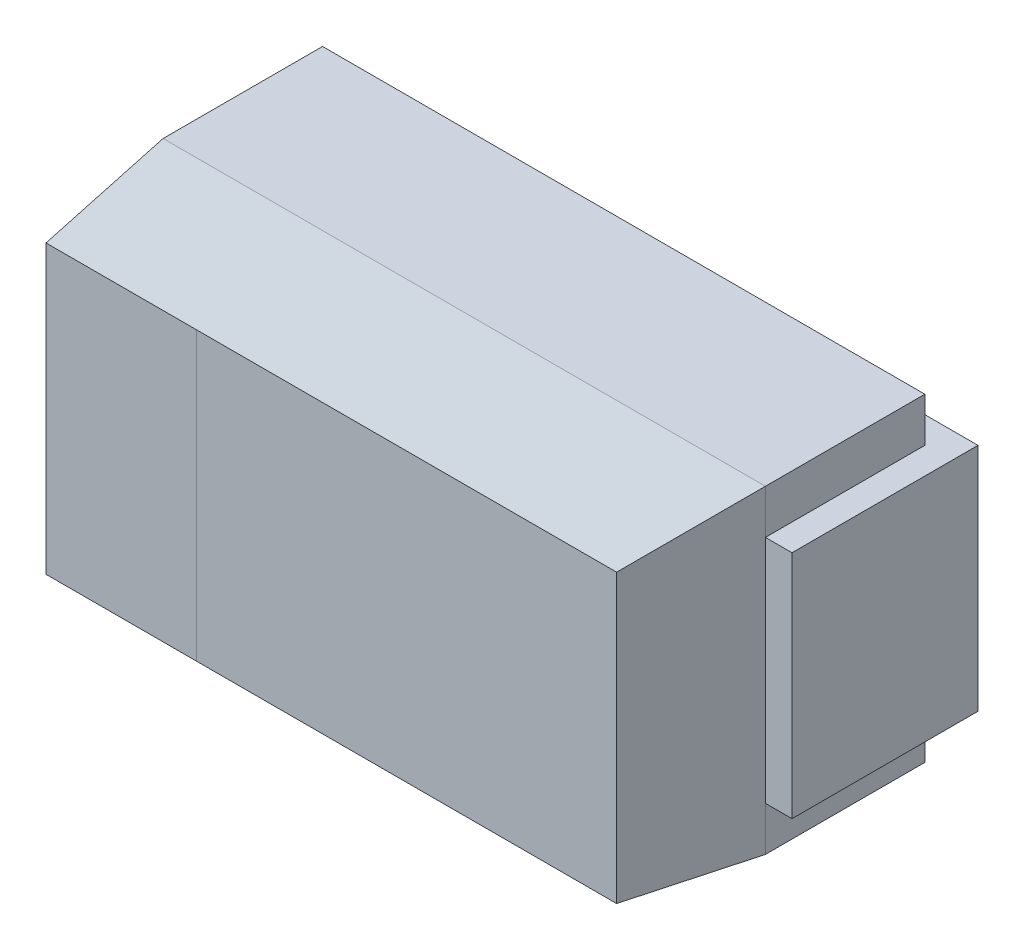
ISO-10303-21;
HEADER;
FILE_DESCRIPTION(('STEP AP214'),'2;1');
FILE_NAME('part.step','',(''),(''),'','','');
FILE_SCHEMA(('AUTOMOTIVE_DESIGN { 1 0 10303 214 1 1 1 1 }'));
ENDSEC;
DATA;
#1=APPLICATION_CONTEXT('core data for automotive mechanical design processes');
#2=APPLICATION_PROTOCOL_DEFINITION('international standard','automotive_design',2000,#1);
#3=PRODUCT_CONTEXT('',#1,'mechanical');
#4=PRODUCT('Part','Part','',(#3));
#5=PRODUCT_RELATED_PRODUCT_CATEGORY('part','',(#4));
#6=PRODUCT_DEFINITION_FORMATION('','',#4);
#7=PRODUCT_DEFINITION_CONTEXT('part definition',#1,'design');
#8=PRODUCT_DEFINITION('design','',#6,#7);
#9=PRODUCT_DEFINITION_SHAPE('','',#8);
#10=(LENGTH_UNIT() NAMED_UNIT(*) SI_UNIT(.MILLI.,.METRE.));
#11=(NAMED_UNIT(*) PLANE_ANGLE_UNIT() SI_UNIT($,.RADIAN.));
#12=(NAMED_UNIT(*) SI_UNIT($,.STERADIAN.) SOLID_ANGLE_UNIT());
#13=UNCERTAINTY_MEASURE_WITH_UNIT(LENGTH_MEASURE(1.E-05),#10,'distance_accuracy_value','');
#14=(GEOMETRIC_REPRESENTATION_CONTEXT(3) GLOBAL_UNCERTAINTY_ASSIGNED_CONTEXT((#13)) GLOBAL_UNIT_ASSIGNED_CONTEXT((#10,
#11,#12)) REPRESENTATION_CONTEXT('',''));
#15=CARTESIAN_POINT('',(0.,0.,0.));
#16=DIRECTION('',(0.,0.,1.));
#17=DIRECTION('',(1.,0.,0.));
#18=AXIS2_PLACEMENT_3D('',#15,#16,#17);
#19=CARTESIAN_POINT('',(-1.60988085477938,0.901,1.80099287683849));
#20=DIRECTION('',(-0.992876838486922,0.,0.119145220618434));
#21=DIRECTION('',(-0.119145220618434,0.,-0.992876838486922));
#22=AXIS2_PLACEMENT_3D('',#19,#20,#21);
#23=PLANE('',#22);
#24=CARTESIAN_POINT('',(-1.60976340694006,0.81,1.802));
#25=DIRECTION('',(0.,-1.,0.));
#26=VECTOR('',#25,1.);
#27=LINE('',#24,#26);
#28=CARTESIAN_POINT('',(-1.60996056782334,0.81,1.8009952681388));
#29=VERTEX_POINT('',#28);
#30=CARTESIAN_POINT('',(-1.60992113564669,-0.81,1.8009952681388));
#31=VERTEX_POINT('',#30);
#32=EDGE_CURVE('E416',#29,#31,#27,.T.);
#33=ORIENTED_EDGE('',*,*,#32,.F.);
#34=CARTESIAN_POINT('',(-1.61,0.81,1.8));
#35=DIRECTION('',(-0.118308451008768,0.118308451008765,-0.985903758406373));
#36=VECTOR('',#35,1.);
#37=LINE('',#34,#36);
#38=CARTESIAN_POINT('',(-1.7,0.9,1.05));
#39=VERTEX_POINT('',#38);
#40=EDGE_CURVE('E198',#29,#39,#37,.T.);
#41=ORIENTED_EDGE('',*,*,#40,.T.);
#42=DIRECTION('',(0.,-1.,0.));
#43=VECTOR('',#42,1.);
#44=CARTESIAN_POINT('',(-1.7,0.,1.05));
#45=LINE('',#44,#43);
#46=CARTESIAN_POINT('',(-1.7,0.65,1.05));
#47=VERTEX_POINT('',#46);
#48=EDGE_CURVE('E387',#39,#47,#45,.T.);
#49=ORIENTED_EDGE('',*,*,#48,.T.);
#50=DIRECTION('',(0.,1.,0.));
#51=VECTOR('',#50,1.);
#52=CARTESIAN_POINT('',(-1.7,0.,1.05));
#53=LINE('',#52,#51);
#54=CARTESIAN_POINT('',(-1.7,-0.65,1.05));
#55=VERTEX_POINT('',#54);
#56=EDGE_CURVE('E404',#55,#47,#53,.T.);
#57=ORIENTED_EDGE('',*,*,#56,.F.);
#58=DIRECTION('',(0.,-1.,0.));
#59=VECTOR('',#58,1.);
#60=CARTESIAN_POINT('',(-1.7,0.,1.05));
#61=LINE('',#60,#59);
#62=CARTESIAN_POINT('',(-1.7,-0.9,1.05));
#63=VERTEX_POINT('',#62);
#64=EDGE_CURVE('E389',#55,#63,#61,.T.);
#65=ORIENTED_EDGE('',*,*,#64,.T.);
#66=CARTESIAN_POINT('',(-1.7,-0.9,1.05));
#67=DIRECTION('',(0.118308451008768,0.118308451008765,0.985903758406373));
#68=VECTOR('',#67,1.);
#69=LINE('',#66,#68);
#70=EDGE_CURVE('E165',#63,#31,#69,.T.);
#71=ORIENTED_EDGE('',*,*,#70,.T.);
#72=EDGE_LOOP('',(#33,#41,#49,#57,#65,#71));
#73=FACE_BOUND('',#72,.T.);
#74=ADVANCED_FACE('F16',(#73),#23,.T.);
#75=CARTESIAN_POINT('',(-1.851,0.651,1.05));
#76=DIRECTION('',(0.,0.,1.));
#77=DIRECTION('',(0.,-1.,0.));
#78=AXIS2_PLACEMENT_3D('',#75,#76,#77);
#79=PLANE('',#78);
#80=ORIENTED_EDGE('',*,*,#56,.T.);
#81=DIRECTION('',(-1.,0.,0.));
#82=VECTOR('',#81,1.);
#83=CARTESIAN_POINT('',(-1.775,0.65,1.05));
#84=LINE('',#83,#82);
#85=CARTESIAN_POINT('',(-1.85,0.65,1.05));
#86=VERTEX_POINT('',#85);
#87=EDGE_CURVE('E407',#47,#86,#84,.T.);
#88=ORIENTED_EDGE('',*,*,#87,.T.);
#89=DIRECTION('',(0.,1.,0.));
#90=VECTOR('',#89,1.);
#91=CARTESIAN_POINT('',(-1.85,0.,1.05));
#92=LINE('',#91,#90);
#93=CARTESIAN_POINT('',(-1.85,-0.65,1.05));
#94=VERTEX_POINT('',#93);
#95=EDGE_CURVE('E360',#94,#86,#92,.T.);
#96=ORIENTED_EDGE('',*,*,#95,.F.);
#97=DIRECTION('',(1.,0.,0.));
#98=VECTOR('',#97,1.);
#99=CARTESIAN_POINT('',(-1.775,-0.65,1.05));
#100=LINE('',#99,#98);
#101=EDGE_CURVE('E408',#94,#55,#100,.T.);
#102=ORIENTED_EDGE('',*,*,#101,.T.);
#103=EDGE_LOOP('',(#80,#88,#96,#102));
#104=FACE_BOUND('',#103,.T.);
#105=ADVANCED_FACE('F440',(#104),#79,.T.);
#106=CARTESIAN_POINT('',(-1.611,0.811,1.802));
#107=DIRECTION('',(0.,0.,1.));
#108=DIRECTION('',(0.,-1.,0.));
#109=AXIS2_PLACEMENT_3D('',#106,#107,#108);
#110=PLANE('',#109);
#111=DIRECTION('',(1.,0.,0.));
#112=VECTOR('',#111,1.);
#113=CARTESIAN_POINT('',(-1.701,0.80976,1.802));
#114=LINE('',#113,#112);
#115=CARTESIAN_POINT('',(-0.76,0.81,1.8008));
#116=VERTEX_POINT('',#115);
#117=EDGE_CURVE('E363',#29,#116,#114,.T.);
#118=ORIENTED_EDGE('',*,*,#117,.F.);
#119=ORIENTED_EDGE('',*,*,#32,.T.);
#120=DIRECTION('',(-1.,0.,0.));
#121=VECTOR('',#120,1.);
#122=CARTESIAN_POINT('',(-1.701,-0.809760000000001,1.802));
#123=LINE('',#122,#121);
#124=CARTESIAN_POINT('',(-0.76,-0.81,1.8008));
#125=VERTEX_POINT('',#124);
#126=EDGE_CURVE('E158',#125,#31,#123,.T.);
#127=ORIENTED_EDGE('',*,*,#126,.F.);
#128=CARTESIAN_POINT('',(-0.76,0.81,1.8));
#129=DIRECTION('',(0.,-1.,0.));
#130=VECTOR('',#129,1.);
#131=LINE('',#128,#130);
#132=EDGE_CURVE('E376',#116,#125,#131,.T.);
#133=ORIENTED_EDGE('',*,*,#132,.F.);
#134=EDGE_LOOP('',(#118,#119,#127,#133));
#135=FACE_BOUND('',#134,.T.);
#136=ADVANCED_FACE('F468',(#135),#110,.T.);
#137=CARTESIAN_POINT('',(-0.761,0.811,1.8));
#138=DIRECTION('',(0.,0.,1.));
#139=DIRECTION('',(0.,-1.,0.));
#140=AXIS2_PLACEMENT_3D('',#137,#138,#139);
#141=PLANE('',#140);
#142=DIRECTION('',(0.,1.,0.));
#143=VECTOR('',#142,1.);
#144=CARTESIAN_POINT('',(1.61,0.,1.8));
#145=LINE('',#144,#143);
#146=CARTESIAN_POINT('',(1.61,-0.81,1.8));
#147=VERTEX_POINT('',#146);
#148=CARTESIAN_POINT('',(1.61,0.810000000000001,1.8));
#149=VERTEX_POINT('',#148);
#150=EDGE_CURVE('E153',#147,#149,#145,.T.);
#151=ORIENTED_EDGE('',*,*,#150,.T.);
#152=DIRECTION('',(1.,0.,0.));
#153=VECTOR('',#152,1.);
#154=CARTESIAN_POINT('',(0.,0.81,1.8));
#155=LINE('',#154,#153);
#156=EDGE_CURVE('E366',#116,#149,#155,.T.);
#157=ORIENTED_EDGE('',*,*,#156,.F.);
#158=ORIENTED_EDGE('',*,*,#132,.T.);
#159=DIRECTION('',(-1.,0.,0.));
#160=VECTOR('',#159,1.);
#161=CARTESIAN_POINT('',(0.,-0.81,1.8));
#162=LINE('',#161,#160);
#163=EDGE_CURVE('E371',#147,#125,#162,.T.);
#164=ORIENTED_EDGE('',*,*,#163,.F.);
#165=EDGE_LOOP('',(#151,#157,#158,#164));
#166=FACE_BOUND('',#165,.T.);
#167=ADVANCED_FACE('F477',(#166),#141,.T.);
#168=CARTESIAN_POINT('',(-1.701,-0.809880854779382,1.80099287683849));
#169=DIRECTION('',(0.,-0.992876838486922,0.11914522061843));
#170=DIRECTION('',(0.,-0.11914522061843,-0.992876838486922));
#171=AXIS2_PLACEMENT_3D('',#168,#169,#170);
#172=PLANE('',#171);
#173=DIRECTION('',(-1.,0.,0.));
#174=VECTOR('',#173,1.);
#175=CARTESIAN_POINT('',(0.,-0.9,1.05));
#176=LINE('',#175,#174);
#177=CARTESIAN_POINT('',(1.7,-0.9,1.05));
#178=VERTEX_POINT('',#177);
#179=EDGE_CURVE('E161',#178,#63,#176,.T.);
#180=ORIENTED_EDGE('',*,*,#179,.F.);
#181=DIRECTION('',(-0.118308451008765,0.118308451008764,0.985903758406374));
#182=VECTOR('',#181,1.);
#183=CARTESIAN_POINT('',(1.7,-0.899999999999999,1.05));
#184=LINE('',#183,#182);
#185=EDGE_CURVE('E145',#178,#147,#184,.T.);
#186=ORIENTED_EDGE('',*,*,#185,.T.);
#187=ORIENTED_EDGE('',*,*,#163,.T.);
#188=ORIENTED_EDGE('',*,*,#126,.T.);
#189=ORIENTED_EDGE('',*,*,#70,.F.);
#190=EDGE_LOOP('',(#180,#186,#187,#188,#189));
#191=FACE_BOUND('',#190,.T.);
#192=ADVANCED_FACE('F163',(#191),#172,.T.);
#193=CARTESIAN_POINT('',(-1.851,-0.651,0.));
#194=DIRECTION('',(0.,0.,-1.));
#195=DIRECTION('',(0.,1.,0.));
#196=AXIS2_PLACEMENT_3D('',#193,#194,#195);
#197=PLANE('',#196);
#198=DIRECTION('',(0.,1.,0.));
#199=VECTOR('',#198,1.);
#200=CARTESIAN_POINT('',(-0.75,0.,0.));
#201=LINE('',#200,#199);
#202=CARTESIAN_POINT('',(-0.75,-0.65,0.));
#203=VERTEX_POINT('',#202);
#204=CARTESIAN_POINT('',(-0.75,0.65,0.));
#205=VERTEX_POINT('',#204);
#206=EDGE_CURVE('E347',#203,#205,#201,.T.);
#207=ORIENTED_EDGE('',*,*,#206,.F.);
#208=DIRECTION('',(1.,0.,0.));
#209=VECTOR('',#208,1.);
#210=CARTESIAN_POINT('',(-1.3,-0.65,0.));
#211=LINE('',#210,#209);
#212=CARTESIAN_POINT('',(-1.85,-0.65,0.));
#213=VERTEX_POINT('',#212);
#214=EDGE_CURVE('E354',#213,#203,#211,.T.);
#215=ORIENTED_EDGE('',*,*,#214,.F.);
#216=DIRECTION('',(0.,-1.,0.));
#217=VECTOR('',#216,1.);
#218=CARTESIAN_POINT('',(-1.85,0.,0.));
#219=LINE('',#218,#217);
#220=CARTESIAN_POINT('',(-1.85,0.65,0.));
#221=VERTEX_POINT('',#220);
#222=EDGE_CURVE('E157',#221,#213,#219,.T.);
#223=ORIENTED_EDGE('',*,*,#222,.F.);
#224=DIRECTION('',(-1.,0.,0.));
#225=VECTOR('',#224,1.);
#226=CARTESIAN_POINT('',(-1.3,0.65,0.));
#227=LINE('',#226,#225);
#228=EDGE_CURVE('E341',#205,#221,#227,.T.);
#229=ORIENTED_EDGE('',*,*,#228,.F.);
#230=EDGE_LOOP('',(#207,#215,#223,#229));
#231=FACE_BOUND('',#230,.T.);
#232=ADVANCED_FACE('F508',(#231),#197,.T.);
#233=CARTESIAN_POINT('',(-1.85,0.651,-0.001));
#234=DIRECTION('',(-1.,0.,0.));
#235=DIRECTION('',(0.,-1.,0.));
#236=AXIS2_PLACEMENT_3D('',#233,#234,#235);
#237=PLANE('',#236);
#238=ORIENTED_EDGE('',*,*,#95,.T.);
#239=DIRECTION('',(0.,0.,1.));
#240=VECTOR('',#239,1.);
#241=CARTESIAN_POINT('',(-1.85,0.65,0.525));
#242=LINE('',#241,#240);
#243=EDGE_CURVE('E338',#221,#86,#242,.T.);
#244=ORIENTED_EDGE('',*,*,#243,.F.);
#245=ORIENTED_EDGE('',*,*,#222,.T.);
#246=DIRECTION('',(0.,0.,-1.));
#247=VECTOR('',#246,1.);
#248=CARTESIAN_POINT('',(-1.85,-0.65,0.525));
#249=LINE('',#248,#247);
#250=EDGE_CURVE('E350',#94,#213,#249,.T.);
#251=ORIENTED_EDGE('',*,*,#250,.F.);
#252=EDGE_LOOP('',(#238,#244,#245,#251));
#253=FACE_BOUND('',#252,.T.);
#254=ADVANCED_FACE('F216',(#253),#237,.T.);
#255=CARTESIAN_POINT('',(-1.701,0.900119145220619,1.04900712316151));
#256=DIRECTION('',(0.,0.992876838486922,0.119145220618431));
#257=DIRECTION('',(0.,-0.119145220618431,0.992876838486922));
#258=AXIS2_PLACEMENT_3D('',#255,#256,#257);
#259=PLANE('',#258);
#260=DIRECTION('',(1.,0.,0.));
#261=VECTOR('',#260,1.);
#262=CARTESIAN_POINT('',(0.,0.9,1.05));
#263=LINE('',#262,#261);
#264=CARTESIAN_POINT('',(1.7,0.9,1.05000000000001));
#265=VERTEX_POINT('',#264);
#266=EDGE_CURVE('E380',#39,#265,#263,.T.);
#267=ORIENTED_EDGE('',*,*,#266,.F.);
#268=ORIENTED_EDGE('',*,*,#40,.F.);
#269=ORIENTED_EDGE('',*,*,#117,.T.);
#270=ORIENTED_EDGE('',*,*,#156,.T.);
#271=DIRECTION('',(0.118308451008765,0.118308451008765,-0.985903758406374));
#272=VECTOR('',#271,1.);
#273=CARTESIAN_POINT('',(1.61,0.81,1.8));
#274=LINE('',#273,#272);
#275=EDGE_CURVE('E359',#149,#265,#274,.T.);
#276=ORIENTED_EDGE('',*,*,#275,.T.);
#277=EDGE_LOOP('',(#267,#268,#269,#270,#276));
#278=FACE_BOUND('',#277,.T.);
#279=ADVANCED_FACE('F205',(#278),#259,.T.);
#280=CARTESIAN_POINT('',(0.75,0.651,-0.001));
#281=DIRECTION('',(-1.,0.,0.));
#282=DIRECTION('',(0.,-1.,0.));
#283=AXIS2_PLACEMENT_3D('',#280,#281,#282);
#284=PLANE('',#283);
#285=DIRECTION('',(0.,-1.,0.));
#286=VECTOR('',#285,1.);
#287=CARTESIAN_POINT('',(0.75,0.,0.15));
#288=LINE('',#287,#286);
#289=CARTESIAN_POINT('',(0.75,0.65,0.15));
#290=VERTEX_POINT('',#289);
#291=CARTESIAN_POINT('',(0.75,-0.65,0.15));
#292=VERTEX_POINT('',#291);
#293=EDGE_CURVE('E179',#290,#292,#288,.T.);
#294=ORIENTED_EDGE('',*,*,#293,.F.);
#295=DIRECTION('',(0.,0.,-1.));
#296=VECTOR('',#295,1.);
#297=CARTESIAN_POINT('',(0.75,0.65,0.075));
#298=LINE('',#297,#296);
#299=CARTESIAN_POINT('',(0.75,0.65,0.));
#300=VERTEX_POINT('',#299);
#301=EDGE_CURVE('E171',#290,#300,#298,.T.);
#302=ORIENTED_EDGE('',*,*,#301,.T.);
#303=DIRECTION('',(0.,1.,0.));
#304=VECTOR('',#303,1.);
#305=CARTESIAN_POINT('',(0.75,0.,0.));
#306=LINE('',#305,#304);
#307=CARTESIAN_POINT('',(0.75,-0.65,0.));
#308=VERTEX_POINT('',#307);
#309=EDGE_CURVE('E180',#308,#300,#306,.T.);
#310=ORIENTED_EDGE('',*,*,#309,.F.);
#311=DIRECTION('',(0.,0.,1.));
#312=VECTOR('',#311,1.);
#313=CARTESIAN_POINT('',(0.75,-0.65,0.075));
#314=LINE('',#313,#312);
#315=EDGE_CURVE('E282',#308,#292,#314,.T.);
#316=ORIENTED_EDGE('',*,*,#315,.T.);
#317=EDGE_LOOP('',(#294,#302,#310,#316));
#318=FACE_BOUND('',#317,.T.);
#319=ADVANCED_FACE('F215',(#318),#284,.T.);
#320=CARTESIAN_POINT('',(-1.701,-0.9,1.051));
#321=DIRECTION('',(0.,-1.,0.));
#322=DIRECTION('',(0.,0.,-1.));
#323=AXIS2_PLACEMENT_3D('',#320,#321,#322);
#324=PLANE('',#323);
#325=DIRECTION('',(-1.,0.,0.));
#326=VECTOR('',#325,1.);
#327=CARTESIAN_POINT('',(0.,-0.9,0.15));
#328=LINE('',#327,#326);
#329=CARTESIAN_POINT('',(1.7,-0.9,0.15));
#330=VERTEX_POINT('',#329);
#331=CARTESIAN_POINT('',(-1.7,-0.9,0.15));
#332=VERTEX_POINT('',#331);
#333=EDGE_CURVE('E177',#330,#332,#328,.T.);
#334=ORIENTED_EDGE('',*,*,#333,.F.);
#335=DIRECTION('',(0.,0.,-1.));
#336=VECTOR('',#335,1.);
#337=CARTESIAN_POINT('',(1.7,-0.9,0.6));
#338=LINE('',#337,#336);
#339=EDGE_CURVE('E174',#178,#330,#338,.T.);
#340=ORIENTED_EDGE('',*,*,#339,.F.);
#341=ORIENTED_EDGE('',*,*,#179,.T.);
#342=DIRECTION('',(0.,0.,1.));
#343=VECTOR('',#342,1.);
#344=CARTESIAN_POINT('',(-1.7,-0.9,0.6));
#345=LINE('',#344,#343);
#346=EDGE_CURVE('E170',#332,#63,#345,.T.);
#347=ORIENTED_EDGE('',*,*,#346,.F.);
#348=EDGE_LOOP('',(#334,#340,#341,#347));
#349=FACE_BOUND('',#348,.T.);
#350=ADVANCED_FACE('F175',(#349),#324,.T.);
#351=CARTESIAN_POINT('',(-1.7,-0.649,1.051));
#352=DIRECTION('',(-1.,0.,0.));
#353=DIRECTION('',(0.,0.,-1.));
#354=AXIS2_PLACEMENT_3D('',#351,#352,#353);
#355=PLANE('',#354);
#356=ORIENTED_EDGE('',*,*,#346,.T.);
#357=ORIENTED_EDGE('',*,*,#64,.F.);
#358=DIRECTION('',(0.,0.,1.));
#359=VECTOR('',#358,1.);
#360=CARTESIAN_POINT('',(-1.7,-0.65,0.525));
#361=LINE('',#360,#359);
#362=CARTESIAN_POINT('',(-1.7,-0.65,0.15));
#363=VERTEX_POINT('',#362);
#364=EDGE_CURVE('E353',#363,#55,#361,.T.);
#365=ORIENTED_EDGE('',*,*,#364,.F.);
#366=DIRECTION('',(0.,1.,0.));
#367=VECTOR('',#366,1.);
#368=CARTESIAN_POINT('',(-1.7,0.,0.15));
#369=LINE('',#368,#367);
#370=EDGE_CURVE('E325',#332,#363,#369,.T.);
#371=ORIENTED_EDGE('',*,*,#370,.F.);
#372=EDGE_LOOP('',(#356,#357,#365,#371));
#373=FACE_BOUND('',#372,.T.);
#374=ADVANCED_FACE('F223',(#373),#355,.T.);
#375=CARTESIAN_POINT('',(-1.851,-0.65,-0.001));
#376=DIRECTION('',(0.,-1.,0.));
#377=DIRECTION('',(1.,0.,0.));
#378=AXIS2_PLACEMENT_3D('',#375,#376,#377);
#379=PLANE('',#378);
#380=ORIENTED_EDGE('',*,*,#101,.F.);
#381=ORIENTED_EDGE('',*,*,#250,.T.);
#382=ORIENTED_EDGE('',*,*,#214,.T.);
#383=DIRECTION('',(0.,0.,-1.));
#384=VECTOR('',#383,1.);
#385=CARTESIAN_POINT('',(-0.75,-0.65,0.075));
#386=LINE('',#385,#384);
#387=CARTESIAN_POINT('',(-0.75,-0.65,0.15));
#388=VERTEX_POINT('',#387);
#389=EDGE_CURVE('E344',#388,#203,#386,.T.);
#390=ORIENTED_EDGE('',*,*,#389,.F.);
#391=DIRECTION('',(1.,0.,0.));
#392=VECTOR('',#391,1.);
#393=CARTESIAN_POINT('',(0.,-0.65,0.15));
#394=LINE('',#393,#392);
#395=EDGE_CURVE('E322',#363,#388,#394,.T.);
#396=ORIENTED_EDGE('',*,*,#395,.F.);
#397=ORIENTED_EDGE('',*,*,#364,.T.);
#398=EDGE_LOOP('',(#380,#381,#382,#390,#396,#397));
#399=FACE_BOUND('',#398,.T.);
#400=ADVANCED_FACE('F226',(#399),#379,.T.);
#401=CARTESIAN_POINT('',(-0.75,-0.651,-0.001));
#402=DIRECTION('',(1.,0.,0.));
#403=DIRECTION('',(0.,1.,0.));
#404=AXIS2_PLACEMENT_3D('',#401,#402,#403);
#405=PLANE('',#404);
#406=DIRECTION('',(0.,1.,0.));
#407=VECTOR('',#406,1.);
#408=CARTESIAN_POINT('',(-0.75,0.,0.15));
#409=LINE('',#408,#407);
#410=CARTESIAN_POINT('',(-0.75,0.65,0.15));
#411=VERTEX_POINT('',#410);
#412=EDGE_CURVE('E319',#388,#411,#409,.T.);
#413=ORIENTED_EDGE('',*,*,#412,.F.);
#414=ORIENTED_EDGE('',*,*,#389,.T.);
#415=ORIENTED_EDGE('',*,*,#206,.T.);
#416=DIRECTION('',(0.,0.,-1.));
#417=VECTOR('',#416,1.);
#418=CARTESIAN_POINT('',(-0.75,0.65,0.525));
#419=LINE('',#418,#417);
#420=EDGE_CURVE('E334',#411,#205,#419,.T.);
#421=ORIENTED_EDGE('',*,*,#420,.F.);
#422=EDGE_LOOP('',(#413,#414,#415,#421));
#423=FACE_BOUND('',#422,.T.);
#424=ADVANCED_FACE('F230',(#423),#405,.T.);
#425=CARTESIAN_POINT('',(-0.749,0.65,-0.001));
#426=DIRECTION('',(0.,1.,0.));
#427=DIRECTION('',(-1.,0.,0.));
#428=AXIS2_PLACEMENT_3D('',#425,#426,#427);
#429=PLANE('',#428);
#430=DIRECTION('',(-1.,0.,0.));
#431=VECTOR('',#430,1.);
#432=CARTESIAN_POINT('',(0.,0.65,0.15));
#433=LINE('',#432,#431);
#434=CARTESIAN_POINT('',(-1.7,0.65,0.15));
#435=VERTEX_POINT('',#434);
#436=EDGE_CURVE('E316',#411,#435,#433,.T.);
#437=ORIENTED_EDGE('',*,*,#436,.F.);
#438=ORIENTED_EDGE('',*,*,#420,.T.);
#439=ORIENTED_EDGE('',*,*,#228,.T.);
#440=ORIENTED_EDGE('',*,*,#243,.T.);
#441=ORIENTED_EDGE('',*,*,#87,.F.);
#442=DIRECTION('',(0.,0.,1.));
#443=VECTOR('',#442,1.);
#444=CARTESIAN_POINT('',(-1.7,0.65,0.6));
#445=LINE('',#444,#443);
#446=EDGE_CURVE('E337',#435,#47,#445,.T.);
#447=ORIENTED_EDGE('',*,*,#446,.F.);
#448=EDGE_LOOP('',(#437,#438,#439,#440,#441,#447));
#449=FACE_BOUND('',#448,.T.);
#450=ADVANCED_FACE('F234',(#449),#429,.T.);
#451=CARTESIAN_POINT('',(-1.7,0.901,1.051));
#452=DIRECTION('',(-1.,0.,0.));
#453=DIRECTION('',(0.,0.,-1.));
#454=AXIS2_PLACEMENT_3D('',#451,#452,#453);
#455=PLANE('',#454);
#456=DIRECTION('',(0.,0.,1.));
#457=VECTOR('',#456,1.);
#458=CARTESIAN_POINT('',(-1.7,0.9,0.6));
#459=LINE('',#458,#457);
#460=CARTESIAN_POINT('',(-1.7,0.9,0.15));
#461=VERTEX_POINT('',#460);
#462=EDGE_CURVE('E377',#461,#39,#459,.T.);
#463=ORIENTED_EDGE('',*,*,#462,.F.);
#464=DIRECTION('',(0.,1.,0.));
#465=VECTOR('',#464,1.);
#466=CARTESIAN_POINT('',(-1.7,0.,0.15));
#467=LINE('',#466,#465);
#468=EDGE_CURVE('E313',#435,#461,#467,.T.);
#469=ORIENTED_EDGE('',*,*,#468,.F.);
#470=ORIENTED_EDGE('',*,*,#446,.T.);
#471=ORIENTED_EDGE('',*,*,#48,.F.);
#472=EDGE_LOOP('',(#463,#469,#470,#471));
#473=FACE_BOUND('',#472,.T.);
#474=ADVANCED_FACE('F238',(#473),#455,.T.);
#475=CARTESIAN_POINT('',(-1.701,0.9,0.149));
#476=DIRECTION('',(0.,1.,0.));
#477=DIRECTION('',(0.,0.,1.));
#478=AXIS2_PLACEMENT_3D('',#475,#476,#477);
#479=PLANE('',#478);
#480=DIRECTION('',(1.,0.,0.));
#481=VECTOR('',#480,1.);
#482=CARTESIAN_POINT('',(0.,0.9,0.15));
#483=LINE('',#482,#481);
#484=CARTESIAN_POINT('',(1.7,0.9,0.15));
#485=VERTEX_POINT('',#484);
#486=EDGE_CURVE('E310',#461,#485,#483,.T.);
#487=ORIENTED_EDGE('',*,*,#486,.F.);
#488=ORIENTED_EDGE('',*,*,#462,.T.);
#489=ORIENTED_EDGE('',*,*,#266,.T.);
#490=DIRECTION('',(0.,0.,1.));
#491=VECTOR('',#490,1.);
#492=CARTESIAN_POINT('',(1.7,0.9,0.6));
#493=LINE('',#492,#491);
#494=EDGE_CURVE('E204',#485,#265,#493,.T.);
#495=ORIENTED_EDGE('',*,*,#494,.F.);
#496=EDGE_LOOP('',(#487,#488,#489,#495));
#497=FACE_BOUND('',#496,.T.);
#498=ADVANCED_FACE('F242',(#497),#479,.T.);
#499=CARTESIAN_POINT('',(1.7,0.901,0.149));
#500=DIRECTION('',(1.,0.,0.));
#501=DIRECTION('',(0.,0.,1.));
#502=AXIS2_PLACEMENT_3D('',#499,#500,#501);
#503=PLANE('',#502);
#504=ORIENTED_EDGE('',*,*,#494,.T.);
#505=DIRECTION('',(0.,1.,0.));
#506=VECTOR('',#505,1.);
#507=CARTESIAN_POINT('',(1.7,0.,1.05));
#508=LINE('',#507,#506);
#509=CARTESIAN_POINT('',(1.7,0.65,1.05));
#510=VERTEX_POINT('',#509);
#511=EDGE_CURVE('E183',#510,#265,#508,.T.);
#512=ORIENTED_EDGE('',*,*,#511,.F.);
#513=DIRECTION('',(0.,0.,1.));
#514=VECTOR('',#513,1.);
#515=CARTESIAN_POINT('',(1.7,0.65,0.525));
#516=LINE('',#515,#514);
#517=CARTESIAN_POINT('',(1.7,0.65,0.15));
#518=VERTEX_POINT('',#517);
#519=EDGE_CURVE('E189',#518,#510,#516,.T.);
#520=ORIENTED_EDGE('',*,*,#519,.F.);
#521=DIRECTION('',(0.,-1.,0.));
#522=VECTOR('',#521,1.);
#523=CARTESIAN_POINT('',(1.7,0.,0.15));
#524=LINE('',#523,#522);
#525=EDGE_CURVE('E308',#485,#518,#524,.T.);
#526=ORIENTED_EDGE('',*,*,#525,.F.);
#527=EDGE_LOOP('',(#504,#512,#520,#526));
#528=FACE_BOUND('',#527,.T.);
#529=ADVANCED_FACE('F246',(#528),#503,.T.);
#530=CARTESIAN_POINT('',(0.749,-0.651,0.));
#531=DIRECTION('',(0.,0.,-1.));
#532=DIRECTION('',(0.,1.,0.));
#533=AXIS2_PLACEMENT_3D('',#530,#531,#532);
#534=PLANE('',#533);
#535=ORIENTED_EDGE('',*,*,#309,.T.);
#536=DIRECTION('',(-1.,0.,0.));
#537=VECTOR('',#536,1.);
#538=CARTESIAN_POINT('',(1.3,0.65,0.));
#539=LINE('',#538,#537);
#540=CARTESIAN_POINT('',(1.85,0.65,0.));
#541=VERTEX_POINT('',#540);
#542=EDGE_CURVE('E302',#541,#300,#539,.T.);
#543=ORIENTED_EDGE('',*,*,#542,.F.);
#544=DIRECTION('',(0.,1.,0.));
#545=VECTOR('',#544,1.);
#546=CARTESIAN_POINT('',(1.85,0.,0.));
#547=LINE('',#546,#545);
#548=CARTESIAN_POINT('',(1.85,-0.65,0.));
#549=VERTEX_POINT('',#548);
#550=EDGE_CURVE('E305',#549,#541,#547,.T.);
#551=ORIENTED_EDGE('',*,*,#550,.F.);
#552=DIRECTION('',(1.,0.,0.));
#553=VECTOR('',#552,1.);
#554=CARTESIAN_POINT('',(1.3,-0.65,0.));
#555=LINE('',#554,#553);
#556=EDGE_CURVE('E186',#308,#549,#555,.T.);
#557=ORIENTED_EDGE('',*,*,#556,.F.);
#558=EDGE_LOOP('',(#535,#543,#551,#557));
#559=FACE_BOUND('',#558,.T.);
#560=ADVANCED_FACE('F250',(#559),#534,.T.);
#561=CARTESIAN_POINT('',(1.7,-0.649,0.149));
#562=DIRECTION('',(1.,0.,0.));
#563=DIRECTION('',(0.,0.,1.));
#564=AXIS2_PLACEMENT_3D('',#561,#562,#563);
#565=PLANE('',#564);
#566=ORIENTED_EDGE('',*,*,#339,.T.);
#567=DIRECTION('',(0.,-1.,0.));
#568=VECTOR('',#567,1.);
#569=CARTESIAN_POINT('',(1.7,0.,0.15));
#570=LINE('',#569,#568);
#571=CARTESIAN_POINT('',(1.7,-0.65,0.15));
#572=VERTEX_POINT('',#571);
#573=EDGE_CURVE('E329',#572,#330,#570,.T.);
#574=ORIENTED_EDGE('',*,*,#573,.F.);
#575=DIRECTION('',(0.,0.,-1.));
#576=VECTOR('',#575,1.);
#577=CARTESIAN_POINT('',(1.7,-0.65,0.525));
#578=LINE('',#577,#576);
#579=CARTESIAN_POINT('',(1.7,-0.65,1.05));
#580=VERTEX_POINT('',#579);
#581=EDGE_CURVE('E35',#580,#572,#578,.T.);
#582=ORIENTED_EDGE('',*,*,#581,.F.);
#583=DIRECTION('',(0.,1.,0.));
#584=VECTOR('',#583,1.);
#585=CARTESIAN_POINT('',(1.7,0.,1.05));
#586=LINE('',#585,#584);
#587=EDGE_CURVE('E150',#178,#580,#586,.T.);
#588=ORIENTED_EDGE('',*,*,#587,.F.);
#589=EDGE_LOOP('',(#566,#574,#582,#588));
#590=FACE_BOUND('',#589,.T.);
#591=ADVANCED_FACE('F182',(#590),#565,.T.);
#592=CARTESIAN_POINT('',(-1.701,-0.901,0.15));
#593=DIRECTION('',(0.,0.,-1.));
#594=DIRECTION('',(0.,1.,0.));
#595=AXIS2_PLACEMENT_3D('',#592,#593,#594);
#596=PLANE('',#595);
#597=ORIENTED_EDGE('',*,*,#486,.T.);
#598=ORIENTED_EDGE('',*,*,#525,.T.);
#599=DIRECTION('',(1.,0.,0.));
#600=VECTOR('',#599,1.);
#601=CARTESIAN_POINT('',(1.3,0.65,0.15));
#602=LINE('',#601,#600);
#603=EDGE_CURVE('E299',#290,#518,#602,.T.);
#604=ORIENTED_EDGE('',*,*,#603,.F.);
#605=ORIENTED_EDGE('',*,*,#293,.T.);
#606=DIRECTION('',(-1.,0.,0.));
#607=VECTOR('',#606,1.);
#608=CARTESIAN_POINT('',(1.3,-0.65,0.15));
#609=LINE('',#608,#607);
#610=EDGE_CURVE('E280',#572,#292,#609,.T.);
#611=ORIENTED_EDGE('',*,*,#610,.F.);
#612=ORIENTED_EDGE('',*,*,#573,.T.);
#613=ORIENTED_EDGE('',*,*,#333,.T.);
#614=ORIENTED_EDGE('',*,*,#370,.T.);
#615=ORIENTED_EDGE('',*,*,#395,.T.);
#616=ORIENTED_EDGE('',*,*,#412,.T.);
#617=ORIENTED_EDGE('',*,*,#436,.T.);
#618=ORIENTED_EDGE('',*,*,#468,.T.);
#619=EDGE_LOOP('',(#597,#598,#604,#605,#611,#612,#613,#614,#615,#616,#617,#618));
#620=FACE_BOUND('',#619,.T.);
#621=ADVANCED_FACE('F257',(#620),#596,.T.);
#622=CARTESIAN_POINT('',(1.85,-0.651,-0.001));
#623=DIRECTION('',(1.,0.,0.));
#624=DIRECTION('',(0.,1.,0.));
#625=AXIS2_PLACEMENT_3D('',#622,#623,#624);
#626=PLANE('',#625);
#627=DIRECTION('',(0.,1.,0.));
#628=VECTOR('',#627,1.);
#629=CARTESIAN_POINT('',(1.85,0.,1.05));
#630=LINE('',#629,#628);
#631=CARTESIAN_POINT('',(1.85,-0.65,1.05));
#632=VERTEX_POINT('',#631);
#633=CARTESIAN_POINT('',(1.85,0.65,1.05));
#634=VERTEX_POINT('',#633);
#635=EDGE_CURVE('E285',#632,#634,#630,.T.);
#636=ORIENTED_EDGE('',*,*,#635,.F.);
#637=DIRECTION('',(0.,0.,1.));
#638=VECTOR('',#637,1.);
#639=CARTESIAN_POINT('',(1.85,-0.65,0.525));
#640=LINE('',#639,#638);
#641=EDGE_CURVE('E290',#549,#632,#640,.T.);
#642=ORIENTED_EDGE('',*,*,#641,.F.);
#643=ORIENTED_EDGE('',*,*,#550,.T.);
#644=DIRECTION('',(0.,0.,-1.));
#645=VECTOR('',#644,1.);
#646=CARTESIAN_POINT('',(1.85,0.65,0.525));
#647=LINE('',#646,#645);
#648=EDGE_CURVE('E184',#634,#541,#647,.T.);
#649=ORIENTED_EDGE('',*,*,#648,.F.);
#650=EDGE_LOOP('',(#636,#642,#643,#649));
#651=FACE_BOUND('',#650,.T.);
#652=ADVANCED_FACE('F260',(#651),#626,.T.);
#653=CARTESIAN_POINT('',(1.851,0.65,-0.001));
#654=DIRECTION('',(0.,1.,0.));
#655=DIRECTION('',(-1.,0.,0.));
#656=AXIS2_PLACEMENT_3D('',#653,#654,#655);
#657=PLANE('',#656);
#658=DIRECTION('',(-1.,0.,0.));
#659=VECTOR('',#658,1.);
#660=CARTESIAN_POINT('',(1.775,0.65,1.05));
#661=LINE('',#660,#659);
#662=EDGE_CURVE('E288',#634,#510,#661,.T.);
#663=ORIENTED_EDGE('',*,*,#662,.F.);
#664=ORIENTED_EDGE('',*,*,#648,.T.);
#665=ORIENTED_EDGE('',*,*,#542,.T.);
#666=ORIENTED_EDGE('',*,*,#301,.F.);
#667=ORIENTED_EDGE('',*,*,#603,.T.);
#668=ORIENTED_EDGE('',*,*,#519,.T.);
#669=EDGE_LOOP('',(#663,#664,#665,#666,#667,#668));
#670=FACE_BOUND('',#669,.T.);
#671=ADVANCED_FACE('F264',(#670),#657,.T.);
#672=CARTESIAN_POINT('',(1.70011914522062,0.901,1.04900712316151));
#673=DIRECTION('',(0.992876838486922,0.,0.119145220618434));
#674=DIRECTION('',(-0.119145220618434,0.,0.992876838486922));
#675=AXIS2_PLACEMENT_3D('',#672,#673,#674);
#676=PLANE('',#675);
#677=ORIENTED_EDGE('',*,*,#511,.T.);
#678=ORIENTED_EDGE('',*,*,#275,.F.);
#679=ORIENTED_EDGE('',*,*,#150,.F.);
#680=ORIENTED_EDGE('',*,*,#185,.F.);
#681=ORIENTED_EDGE('',*,*,#587,.T.);
#682=DIRECTION('',(0.,-1.,0.));
#683=VECTOR('',#682,1.);
#684=CARTESIAN_POINT('',(1.7,0.,1.05));
#685=LINE('',#684,#683);
#686=EDGE_CURVE('E26',#510,#580,#685,.T.);
#687=ORIENTED_EDGE('',*,*,#686,.F.);
#688=EDGE_LOOP('',(#677,#678,#679,#680,#681,#687));
#689=FACE_BOUND('',#688,.T.);
#690=ADVANCED_FACE('F148',(#689),#676,.T.);
#691=CARTESIAN_POINT('',(0.749,-0.65,-0.001));
#692=DIRECTION('',(0.,-1.,0.));
#693=DIRECTION('',(1.,0.,0.));
#694=AXIS2_PLACEMENT_3D('',#691,#692,#693);
#695=PLANE('',#694);
#696=ORIENTED_EDGE('',*,*,#610,.T.);
#697=ORIENTED_EDGE('',*,*,#315,.F.);
#698=ORIENTED_EDGE('',*,*,#556,.T.);
#699=ORIENTED_EDGE('',*,*,#641,.T.);
#700=DIRECTION('',(1.,0.,0.));
#701=VECTOR('',#700,1.);
#702=CARTESIAN_POINT('',(1.775,-0.65,1.05));
#703=LINE('',#702,#701);
#704=EDGE_CURVE('E11',#580,#632,#703,.T.);
#705=ORIENTED_EDGE('',*,*,#704,.F.);
#706=ORIENTED_EDGE('',*,*,#581,.T.);
#707=EDGE_LOOP('',(#696,#697,#698,#699,#705,#706));
#708=FACE_BOUND('',#707,.T.);
#709=ADVANCED_FACE('F270',(#708),#695,.T.);
#710=CARTESIAN_POINT('',(1.699,0.651,1.05));
#711=DIRECTION('',(0.,0.,1.));
#712=DIRECTION('',(0.,-1.,0.));
#713=AXIS2_PLACEMENT_3D('',#710,#711,#712);
#714=PLANE('',#713);
#715=ORIENTED_EDGE('',*,*,#686,.T.);
#716=ORIENTED_EDGE('',*,*,#704,.T.);
#717=ORIENTED_EDGE('',*,*,#635,.T.);
#718=ORIENTED_EDGE('',*,*,#662,.T.);
#719=EDGE_LOOP('',(#715,#716,#717,#718));
#720=FACE_BOUND('',#719,.T.);
#721=ADVANCED_FACE('F18',(#720),#714,.T.);
#722=CLOSED_SHELL('',(#74,#105,#136,#167,#192,#232,#254,#279,#319,#350,#374,#400,#424,#450,#474,
#498,#529,#560,#591,#621,#652,#671,#690,#709,#721));
#723=MANIFOLD_SOLID_BREP('B1',#722);
#724=ADVANCED_BREP_SHAPE_REPRESENTATION('',(#18,#723),#14);
#725=SHAPE_DEFINITION_REPRESENTATION(#9,#724);
ENDSEC;
END-ISO-10303-21;
